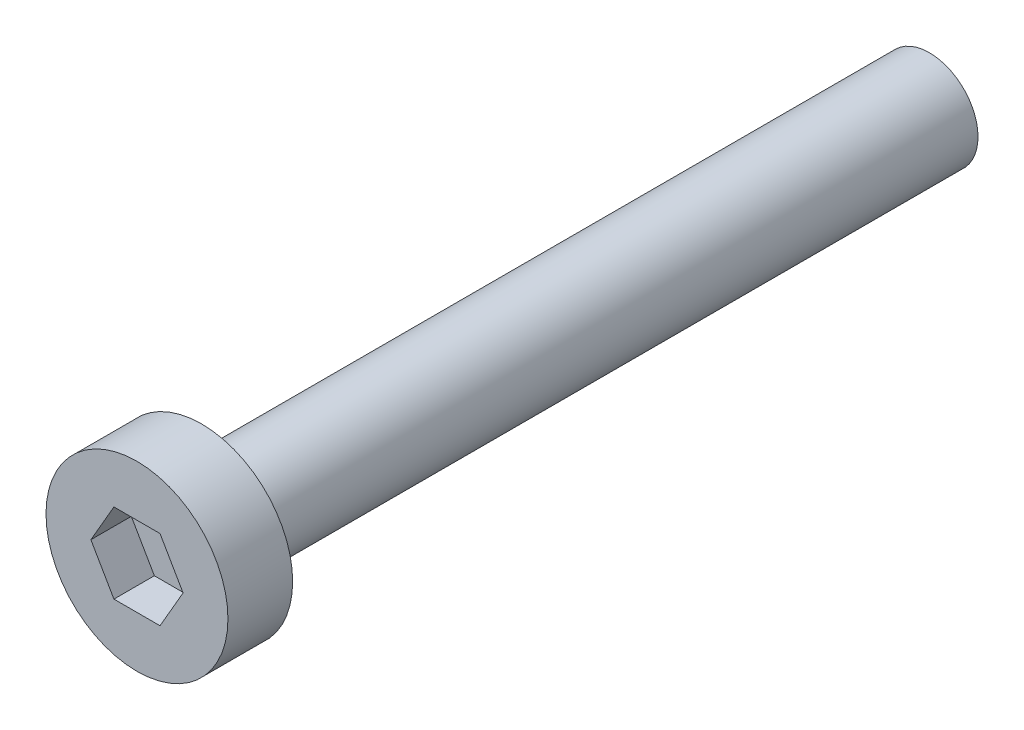
ISO-10303-21;
HEADER;
FILE_DESCRIPTION(('STEP AP214'),'2;1');
FILE_NAME('part.step','',(''),(''),'','','');
FILE_SCHEMA(('AUTOMOTIVE_DESIGN { 1 0 10303 214 1 1 1 1 }'));
ENDSEC;
DATA;
#1=APPLICATION_CONTEXT('core data for automotive mechanical design processes');
#2=APPLICATION_PROTOCOL_DEFINITION('international standard','automotive_design',2000,#1);
#3=PRODUCT_CONTEXT('',#1,'mechanical');
#4=PRODUCT('Part','Part','',(#3));
#5=PRODUCT_RELATED_PRODUCT_CATEGORY('part','',(#4));
#6=PRODUCT_DEFINITION_FORMATION('','',#4);
#7=PRODUCT_DEFINITION_CONTEXT('part definition',#1,'design');
#8=PRODUCT_DEFINITION('design','',#6,#7);
#9=PRODUCT_DEFINITION_SHAPE('','',#8);
#10=(LENGTH_UNIT() NAMED_UNIT(*) SI_UNIT(.MILLI.,.METRE.));
#11=(NAMED_UNIT(*) PLANE_ANGLE_UNIT() SI_UNIT($,.RADIAN.));
#12=(NAMED_UNIT(*) SI_UNIT($,.STERADIAN.) SOLID_ANGLE_UNIT());
#13=UNCERTAINTY_MEASURE_WITH_UNIT(LENGTH_MEASURE(1.E-05),#10,'distance_accuracy_value','');
#14=(GEOMETRIC_REPRESENTATION_CONTEXT(3) GLOBAL_UNCERTAINTY_ASSIGNED_CONTEXT((#13)) GLOBAL_UNIT_ASSIGNED_CONTEXT((#10,
#11,#12)) REPRESENTATION_CONTEXT('',''));
#15=CARTESIAN_POINT('',(0.,0.,0.));
#16=DIRECTION('',(0.,0.,1.));
#17=DIRECTION('',(1.,0.,0.));
#18=AXIS2_PLACEMENT_3D('',#15,#16,#17);
#19=CARTESIAN_POINT('',(0.,0.,0.));
#20=DIRECTION('',(0.,0.,1.));
#21=DIRECTION('',(1.,0.,0.));
#22=AXIS2_PLACEMENT_3D('',#19,#20,#21);
#23=PLANE('',#22);
#24=CARTESIAN_POINT('',(0.,0.,0.));
#25=DIRECTION('',(0.,0.,1.));
#26=DIRECTION('',(1.,0.,0.));
#27=AXIS2_PLACEMENT_3D('',#24,#25,#26);
#28=CIRCLE('',#27,5.625);
#29=CARTESIAN_POINT('',(5.625,0.,0.));
#30=VERTEX_POINT('',#29);
#31=EDGE_CURVE('E134',#30,#30,#28,.T.);
#32=ORIENTED_EDGE('',*,*,#31,.F.);
#33=EDGE_LOOP('',(#32));
#34=FACE_BOUND('',#33,.T.);
#35=CARTESIAN_POINT('',(0.,0.,0.));
#36=DIRECTION('',(0.,0.,1.));
#37=DIRECTION('',(1.,0.,0.));
#38=AXIS2_PLACEMENT_3D('',#35,#36,#37);
#39=CIRCLE('',#38,3.);
#40=CARTESIAN_POINT('',(3.,0.,0.));
#41=VERTEX_POINT('',#40);
#42=EDGE_CURVE('E11',#41,#41,#39,.F.);
#43=ORIENTED_EDGE('',*,*,#42,.F.);
#44=EDGE_LOOP('',(#43));
#45=FACE_BOUND('',#44,.T.);
#46=ADVANCED_FACE('F31',(#34,#45),#23,.F.);
#47=CARTESIAN_POINT('',(0.,0.,4.));
#48=DIRECTION('',(0.,0.,-1.));
#49=DIRECTION('',(-1.,0.,0.));
#50=AXIS2_PLACEMENT_3D('',#47,#48,#49);
#51=CYLINDRICAL_SURFACE('',#50,5.625);
#52=CARTESIAN_POINT('',(0.,0.,4.));
#53=DIRECTION('',(0.,0.,1.));
#54=DIRECTION('',(1.,0.,0.));
#55=AXIS2_PLACEMENT_3D('',#52,#53,#54);
#56=CIRCLE('',#55,5.625);
#57=CARTESIAN_POINT('',(5.625,0.,4.));
#58=VERTEX_POINT('',#57);
#59=EDGE_CURVE('E39',#58,#58,#56,.T.);
#60=ORIENTED_EDGE('',*,*,#59,.F.);
#61=EDGE_LOOP('',(#60));
#62=FACE_BOUND('',#61,.T.);
#63=ORIENTED_EDGE('',*,*,#31,.T.);
#64=EDGE_LOOP('',(#63));
#65=FACE_BOUND('',#64,.T.);
#66=ADVANCED_FACE('F33',(#62,#65),#51,.T.);
#67=CARTESIAN_POINT('',(0.,0.,4.));
#68=DIRECTION('',(0.,0.,1.));
#69=DIRECTION('',(1.,0.,0.));
#70=AXIS2_PLACEMENT_3D('',#67,#68,#69);
#71=PLANE('',#70);
#72=DIRECTION('',(0.5,0.866025403784439,0.));
#73=VECTOR('',#72,1.);
#74=CARTESIAN_POINT('',(1.425,-2.46817240078565,4.));
#75=LINE('',#74,#73);
#76=CARTESIAN_POINT('',(1.425,-2.46817240078565,4.));
#77=VERTEX_POINT('',#76);
#78=CARTESIAN_POINT('',(2.85,0.,4.));
#79=VERTEX_POINT('',#78);
#80=EDGE_CURVE('E46',#77,#79,#75,.T.);
#81=ORIENTED_EDGE('',*,*,#80,.F.);
#82=DIRECTION('',(1.,0.,0.));
#83=VECTOR('',#82,1.);
#84=CARTESIAN_POINT('',(-1.425,-2.46817240078565,4.));
#85=LINE('',#84,#83);
#86=CARTESIAN_POINT('',(-1.425,-2.46817240078565,4.));
#87=VERTEX_POINT('',#86);
#88=EDGE_CURVE('E130',#87,#77,#85,.T.);
#89=ORIENTED_EDGE('',*,*,#88,.F.);
#90=DIRECTION('',(0.5,-0.866025403784439,0.));
#91=VECTOR('',#90,1.);
#92=CARTESIAN_POINT('',(-2.85,0.,4.));
#93=LINE('',#92,#91);
#94=CARTESIAN_POINT('',(-2.85,0.,4.));
#95=VERTEX_POINT('',#94);
#96=EDGE_CURVE('E128',#95,#87,#93,.T.);
#97=ORIENTED_EDGE('',*,*,#96,.F.);
#98=DIRECTION('',(-0.5,-0.866025403784439,0.));
#99=VECTOR('',#98,1.);
#100=CARTESIAN_POINT('',(-1.425,2.46817240078565,4.));
#101=LINE('',#100,#99);
#102=CARTESIAN_POINT('',(-1.425,2.46817240078565,4.));
#103=VERTEX_POINT('',#102);
#104=EDGE_CURVE('E94',#103,#95,#101,.T.);
#105=ORIENTED_EDGE('',*,*,#104,.F.);
#106=DIRECTION('',(-1.,0.,0.));
#107=VECTOR('',#106,1.);
#108=CARTESIAN_POINT('',(1.425,2.46817240078565,4.));
#109=LINE('',#108,#107);
#110=CARTESIAN_POINT('',(1.425,2.46817240078565,4.));
#111=VERTEX_POINT('',#110);
#112=EDGE_CURVE('E124',#111,#103,#109,.T.);
#113=ORIENTED_EDGE('',*,*,#112,.F.);
#114=DIRECTION('',(-0.5,0.866025403784438,0.));
#115=VECTOR('',#114,1.);
#116=CARTESIAN_POINT('',(2.85,0.,4.));
#117=LINE('',#116,#115);
#118=EDGE_CURVE('E120',#79,#111,#117,.T.);
#119=ORIENTED_EDGE('',*,*,#118,.F.);
#120=EDGE_LOOP('',(#81,#89,#97,#105,#113,#119));
#121=FACE_BOUND('',#120,.T.);
#122=ORIENTED_EDGE('',*,*,#59,.T.);
#123=EDGE_LOOP('',(#122));
#124=FACE_BOUND('',#123,.T.);
#125=ADVANCED_FACE('F181',(#121,#124),#71,.T.);
#126=CARTESIAN_POINT('',(1.425,-2.46817240078565,1.5));
#127=DIRECTION('',(0.866025403784439,-0.5,0.));
#128=DIRECTION('',(0.5,0.866025403784439,0.));
#129=AXIS2_PLACEMENT_3D('',#126,#127,#128);
#130=PLANE('',#129);
#131=ORIENTED_EDGE('',*,*,#80,.T.);
#132=DIRECTION('',(0.,0.,1.));
#133=VECTOR('',#132,1.);
#134=CARTESIAN_POINT('',(2.85,0.,1.5));
#135=LINE('',#134,#133);
#136=CARTESIAN_POINT('',(2.85,0.,1.5));
#137=VERTEX_POINT('',#136);
#138=EDGE_CURVE('E76',#137,#79,#135,.T.);
#139=ORIENTED_EDGE('',*,*,#138,.F.);
#140=DIRECTION('',(0.5,0.866025403784439,0.));
#141=VECTOR('',#140,1.);
#142=CARTESIAN_POINT('',(1.425,-2.46817240078565,1.5));
#143=LINE('',#142,#141);
#144=CARTESIAN_POINT('',(1.425,-2.46817240078565,1.5));
#145=VERTEX_POINT('',#144);
#146=EDGE_CURVE('E132',#145,#137,#143,.T.);
#147=ORIENTED_EDGE('',*,*,#146,.F.);
#148=DIRECTION('',(0.,0.,1.));
#149=VECTOR('',#148,1.);
#150=CARTESIAN_POINT('',(1.425,-2.46817240078565,1.5));
#151=LINE('',#150,#149);
#152=EDGE_CURVE('E54',#145,#77,#151,.T.);
#153=ORIENTED_EDGE('',*,*,#152,.T.);
#154=EDGE_LOOP('',(#131,#139,#147,#153));
#155=FACE_BOUND('',#154,.T.);
#156=ADVANCED_FACE('F167',(#155),#130,.F.);
#157=CARTESIAN_POINT('',(-1.425,-2.46817240078565,1.5));
#158=DIRECTION('',(0.,-1.,0.));
#159=DIRECTION('',(1.,0.,0.));
#160=AXIS2_PLACEMENT_3D('',#157,#158,#159);
#161=PLANE('',#160);
#162=ORIENTED_EDGE('',*,*,#88,.T.);
#163=ORIENTED_EDGE('',*,*,#152,.F.);
#164=DIRECTION('',(1.,0.,0.));
#165=VECTOR('',#164,1.);
#166=CARTESIAN_POINT('',(-1.425,-2.46817240078565,1.5));
#167=LINE('',#166,#165);
#168=CARTESIAN_POINT('',(-1.425,-2.46817240078565,1.5));
#169=VERTEX_POINT('',#168);
#170=EDGE_CURVE('E106',#169,#145,#167,.T.);
#171=ORIENTED_EDGE('',*,*,#170,.F.);
#172=DIRECTION('',(0.,0.,1.));
#173=VECTOR('',#172,1.);
#174=CARTESIAN_POINT('',(-1.425,-2.46817240078565,1.5));
#175=LINE('',#174,#173);
#176=EDGE_CURVE('E98',#169,#87,#175,.T.);
#177=ORIENTED_EDGE('',*,*,#176,.T.);
#178=EDGE_LOOP('',(#162,#163,#171,#177));
#179=FACE_BOUND('',#178,.T.);
#180=ADVANCED_FACE('F164',(#179),#161,.F.);
#181=CARTESIAN_POINT('',(-2.85,0.,1.5));
#182=DIRECTION('',(-0.866025403784439,-0.5,0.));
#183=DIRECTION('',(0.5,-0.866025403784439,0.));
#184=AXIS2_PLACEMENT_3D('',#181,#182,#183);
#185=PLANE('',#184);
#186=ORIENTED_EDGE('',*,*,#96,.T.);
#187=ORIENTED_EDGE('',*,*,#176,.F.);
#188=DIRECTION('',(0.5,-0.866025403784439,0.));
#189=VECTOR('',#188,1.);
#190=CARTESIAN_POINT('',(-2.85,0.,1.5));
#191=LINE('',#190,#189);
#192=CARTESIAN_POINT('',(-2.85,0.,1.5));
#193=VERTEX_POINT('',#192);
#194=EDGE_CURVE('E102',#193,#169,#191,.T.);
#195=ORIENTED_EDGE('',*,*,#194,.F.);
#196=DIRECTION('',(0.,0.,1.));
#197=VECTOR('',#196,1.);
#198=CARTESIAN_POINT('',(-2.85,0.,1.5));
#199=LINE('',#198,#197);
#200=EDGE_CURVE('E87',#193,#95,#199,.T.);
#201=ORIENTED_EDGE('',*,*,#200,.T.);
#202=EDGE_LOOP('',(#186,#187,#195,#201));
#203=FACE_BOUND('',#202,.T.);
#204=ADVANCED_FACE('F103',(#203),#185,.F.);
#205=CARTESIAN_POINT('',(-1.425,2.46817240078565,1.5));
#206=DIRECTION('',(-0.866025403784439,0.5,0.));
#207=DIRECTION('',(-0.5,-0.866025403784439,0.));
#208=AXIS2_PLACEMENT_3D('',#205,#206,#207);
#209=PLANE('',#208);
#210=ORIENTED_EDGE('',*,*,#104,.T.);
#211=ORIENTED_EDGE('',*,*,#200,.F.);
#212=DIRECTION('',(-0.5,-0.866025403784439,0.));
#213=VECTOR('',#212,1.);
#214=CARTESIAN_POINT('',(-1.425,2.46817240078565,1.5));
#215=LINE('',#214,#213);
#216=CARTESIAN_POINT('',(-1.425,2.46817240078565,1.5));
#217=VERTEX_POINT('',#216);
#218=EDGE_CURVE('E91',#217,#193,#215,.T.);
#219=ORIENTED_EDGE('',*,*,#218,.F.);
#220=DIRECTION('',(0.,0.,1.));
#221=VECTOR('',#220,1.);
#222=CARTESIAN_POINT('',(-1.425,2.46817240078565,1.5));
#223=LINE('',#222,#221);
#224=EDGE_CURVE('E99',#217,#103,#223,.T.);
#225=ORIENTED_EDGE('',*,*,#224,.T.);
#226=EDGE_LOOP('',(#210,#211,#219,#225));
#227=FACE_BOUND('',#226,.T.);
#228=ADVANCED_FACE('F89',(#227),#209,.F.);
#229=CARTESIAN_POINT('',(1.425,2.46817240078565,1.5));
#230=DIRECTION('',(0.,1.,0.));
#231=DIRECTION('',(0.,0.,1.));
#232=AXIS2_PLACEMENT_3D('',#229,#230,#231);
#233=PLANE('',#232);
#234=ORIENTED_EDGE('',*,*,#112,.T.);
#235=ORIENTED_EDGE('',*,*,#224,.F.);
#236=DIRECTION('',(-1.,0.,0.));
#237=VECTOR('',#236,1.);
#238=CARTESIAN_POINT('',(1.425,2.46817240078565,1.5));
#239=LINE('',#238,#237);
#240=CARTESIAN_POINT('',(1.425,2.46817240078565,1.5));
#241=VERTEX_POINT('',#240);
#242=EDGE_CURVE('E112',#241,#217,#239,.T.);
#243=ORIENTED_EDGE('',*,*,#242,.F.);
#244=DIRECTION('',(0.,0.,1.));
#245=VECTOR('',#244,1.);
#246=CARTESIAN_POINT('',(1.425,2.46817240078565,1.5));
#247=LINE('',#246,#245);
#248=EDGE_CURVE('E137',#241,#111,#247,.T.);
#249=ORIENTED_EDGE('',*,*,#248,.T.);
#250=EDGE_LOOP('',(#234,#235,#243,#249));
#251=FACE_BOUND('',#250,.T.);
#252=ADVANCED_FACE('F172',(#251),#233,.F.);
#253=CARTESIAN_POINT('',(2.85,0.,1.5));
#254=DIRECTION('',(0.866025403784439,0.5,0.));
#255=DIRECTION('',(-0.5,0.866025403784439,0.));
#256=AXIS2_PLACEMENT_3D('',#253,#254,#255);
#257=PLANE('',#256);
#258=ORIENTED_EDGE('',*,*,#118,.T.);
#259=ORIENTED_EDGE('',*,*,#248,.F.);
#260=DIRECTION('',(-0.5,0.866025403784438,0.));
#261=VECTOR('',#260,1.);
#262=CARTESIAN_POINT('',(2.85,0.,1.5));
#263=LINE('',#262,#261);
#264=EDGE_CURVE('E114',#137,#241,#263,.T.);
#265=ORIENTED_EDGE('',*,*,#264,.F.);
#266=ORIENTED_EDGE('',*,*,#138,.T.);
#267=EDGE_LOOP('',(#258,#259,#265,#266));
#268=FACE_BOUND('',#267,.T.);
#269=ADVANCED_FACE('F160',(#268),#257,.F.);
#270=CARTESIAN_POINT('',(2.85,0.,1.5));
#271=DIRECTION('',(0.,0.,1.));
#272=DIRECTION('',(1.,0.,0.));
#273=AXIS2_PLACEMENT_3D('',#270,#271,#272);
#274=PLANE('',#273);
#275=ORIENTED_EDGE('',*,*,#146,.T.);
#276=ORIENTED_EDGE('',*,*,#264,.T.);
#277=ORIENTED_EDGE('',*,*,#242,.T.);
#278=ORIENTED_EDGE('',*,*,#218,.T.);
#279=ORIENTED_EDGE('',*,*,#194,.T.);
#280=ORIENTED_EDGE('',*,*,#170,.T.);
#281=EDGE_LOOP('',(#275,#276,#277,#278,#279,#280));
#282=FACE_BOUND('',#281,.T.);
#283=ADVANCED_FACE('F109',(#282),#274,.T.);
#284=CARTESIAN_POINT('',(0.,0.,-45.));
#285=DIRECTION('',(0.,0.,1.));
#286=DIRECTION('',(1.,0.,0.));
#287=AXIS2_PLACEMENT_3D('',#284,#285,#286);
#288=CYLINDRICAL_SURFACE('',#287,3.);
#289=CARTESIAN_POINT('',(0.,0.,-45.));
#290=DIRECTION('',(0.,0.,-1.));
#291=DIRECTION('',(-1.,0.,0.));
#292=AXIS2_PLACEMENT_3D('',#289,#290,#291);
#293=CIRCLE('',#292,3.);
#294=CARTESIAN_POINT('',(3.,0.,-45.));
#295=VERTEX_POINT('',#294);
#296=EDGE_CURVE('E121',#295,#295,#293,.T.);
#297=CARTESIAN_POINT('',(3.,0.,-45.));
#298=CARTESIAN_POINT('',(3.,0.,-44.53125));
#299=CARTESIAN_POINT('',(3.,0.,-44.0625));
#300=CARTESIAN_POINT('',(3.,0.,-43.125));
#301=CARTESIAN_POINT('',(3.,0.,-42.65625));
#302=CARTESIAN_POINT('',(3.,0.,-41.71875));
#303=CARTESIAN_POINT('',(3.,0.,-41.25));
#304=CARTESIAN_POINT('',(3.,0.,-40.3125));
#305=CARTESIAN_POINT('',(3.,0.,-39.84375));
#306=CARTESIAN_POINT('',(3.,0.,-38.90625));
#307=CARTESIAN_POINT('',(3.,0.,-38.4375));
#308=CARTESIAN_POINT('',(3.,0.,-37.5));
#309=CARTESIAN_POINT('',(3.,0.,-37.03125));
#310=CARTESIAN_POINT('',(3.,0.,-36.09375));
#311=CARTESIAN_POINT('',(3.,0.,-35.625));
#312=CARTESIAN_POINT('',(3.,0.,-34.6875));
#313=CARTESIAN_POINT('',(3.,0.,-34.21875));
#314=CARTESIAN_POINT('',(3.,0.,-33.28125));
#315=CARTESIAN_POINT('',(3.,0.,-32.8125));
#316=CARTESIAN_POINT('',(3.,0.,-31.875));
#317=CARTESIAN_POINT('',(3.,0.,-31.40625));
#318=CARTESIAN_POINT('',(3.,0.,-30.46875));
#319=CARTESIAN_POINT('',(3.,0.,-30.));
#320=CARTESIAN_POINT('',(3.,0.,-29.0625));
#321=CARTESIAN_POINT('',(3.,0.,-28.59375));
#322=CARTESIAN_POINT('',(3.,0.,-27.65625));
#323=CARTESIAN_POINT('',(3.,0.,-27.1875));
#324=CARTESIAN_POINT('',(3.,0.,-26.25));
#325=CARTESIAN_POINT('',(3.,0.,-25.78125));
#326=CARTESIAN_POINT('',(3.,0.,-24.84375));
#327=CARTESIAN_POINT('',(3.,0.,-24.375));
#328=CARTESIAN_POINT('',(3.,0.,-23.4375));
#329=CARTESIAN_POINT('',(3.,0.,-22.96875));
#330=CARTESIAN_POINT('',(3.,0.,-22.03125));
#331=CARTESIAN_POINT('',(3.,0.,-21.5625));
#332=CARTESIAN_POINT('',(3.,0.,-20.625));
#333=CARTESIAN_POINT('',(3.,0.,-20.15625));
#334=CARTESIAN_POINT('',(3.,0.,-19.21875));
#335=CARTESIAN_POINT('',(3.,0.,-18.75));
#336=CARTESIAN_POINT('',(3.,0.,-17.8125));
#337=CARTESIAN_POINT('',(3.,0.,-17.34375));
#338=CARTESIAN_POINT('',(3.,0.,-16.40625));
#339=CARTESIAN_POINT('',(3.,0.,-15.9375));
#340=CARTESIAN_POINT('',(3.,0.,-15.));
#341=CARTESIAN_POINT('',(3.,0.,-14.53125));
#342=CARTESIAN_POINT('',(3.,0.,-13.59375));
#343=CARTESIAN_POINT('',(3.,0.,-13.125));
#344=CARTESIAN_POINT('',(3.,0.,-12.1875));
#345=CARTESIAN_POINT('',(3.,0.,-11.71875));
#346=CARTESIAN_POINT('',(3.,0.,-10.78125));
#347=CARTESIAN_POINT('',(3.,0.,-10.3125));
#348=CARTESIAN_POINT('',(3.,0.,-9.37500000000001));
#349=CARTESIAN_POINT('',(3.,0.,-8.90625000000001));
#350=CARTESIAN_POINT('',(3.,0.,-7.96875000000001));
#351=CARTESIAN_POINT('',(3.,0.,-7.50000000000001));
#352=CARTESIAN_POINT('',(3.,0.,-6.56250000000001));
#353=CARTESIAN_POINT('',(3.,0.,-6.09375000000001));
#354=CARTESIAN_POINT('',(3.,0.,-5.15625000000001));
#355=CARTESIAN_POINT('',(3.,0.,-4.68750000000001));
#356=CARTESIAN_POINT('',(3.,0.,-3.75000000000001));
#357=CARTESIAN_POINT('',(3.,0.,-3.28125000000001));
#358=CARTESIAN_POINT('',(3.,0.,-2.34375000000001));
#359=CARTESIAN_POINT('',(3.,0.,-1.87500000000001));
#360=CARTESIAN_POINT('',(3.,0.,-0.937500000000006));
#361=CARTESIAN_POINT('',(3.,0.,-0.468750000000007));
#362=CARTESIAN_POINT('',(3.,0.,0.));
#363=B_SPLINE_CURVE_WITH_KNOTS('',3,(#297,#298,#299,#300,#301,#302,#303,#304,#305,#306,#307,
#308,#309,#310,#311,#312,#313,#314,#315,#316,#317,#318,#319,#320,#321,#322,#323,#324,#325,#326,
#327,#328,#329,#330,#331,#332,#333,#334,#335,#336,#337,#338,#339,#340,#341,#342,#343,#344,#345,
#346,#347,#348,#349,#350,#351,#352,#353,#354,#355,#356,#357,#358,#359,#360,#361,#362),
.UNSPECIFIED.,.F.,.F.,(4,2,2,2,2,2,2,2,2,2,2,2,2,2,2,2,2,2,2,2,2,2,2,2,2,2,2,2,2,2,2,2,4),(0.,
1.40625,2.8125,4.21875,5.62500000000001,7.03125,8.4375,9.84375,11.25,12.65625,14.0625,15.46875,
16.875,18.28125,19.6875,21.09375,22.5,23.90625,25.3125,26.71875,28.125,29.53125,30.9375,
32.34375,33.75,35.15625,36.5625,37.96875,39.375,40.78125,42.1875,43.59375,45.),.UNSPECIFIED.);
#364=EDGE_CURVE('BSEAM149',#295,#41,#363,.T.);
#365=ORIENTED_EDGE('',*,*,#296,.F.);
#366=ORIENTED_EDGE('',*,*,#42,.T.);
#367=ORIENTED_EDGE('',*,*,#364,.T.);
#368=ORIENTED_EDGE('',*,*,#364,.F.);
#369=EDGE_LOOP('',(#365,#367,#366,#368));
#370=FACE_BOUND('',#369,.T.);
#371=ADVANCED_FACE('F149',(#370),#288,.T.);
#372=CARTESIAN_POINT('',(0.,0.,-45.));
#373=DIRECTION('',(0.,0.,-1.));
#374=DIRECTION('',(-1.,0.,0.));
#375=AXIS2_PLACEMENT_3D('',#372,#373,#374);
#376=PLANE('',#375);
#377=ORIENTED_EDGE('',*,*,#296,.T.);
#378=EDGE_LOOP('',(#377));
#379=FACE_BOUND('',#378,.T.);
#380=ADVANCED_FACE('F151',(#379),#376,.T.);
#381=CLOSED_SHELL('',(#46,#66,#125,#156,#180,#204,#228,#252,#269,#283,#371,#380));
#382=MANIFOLD_SOLID_BREP('B2',#381);
#383=ADVANCED_BREP_SHAPE_REPRESENTATION('',(#18,#382),#14);
#384=SHAPE_DEFINITION_REPRESENTATION(#9,#383);
ENDSEC;
END-ISO-10303-21;
